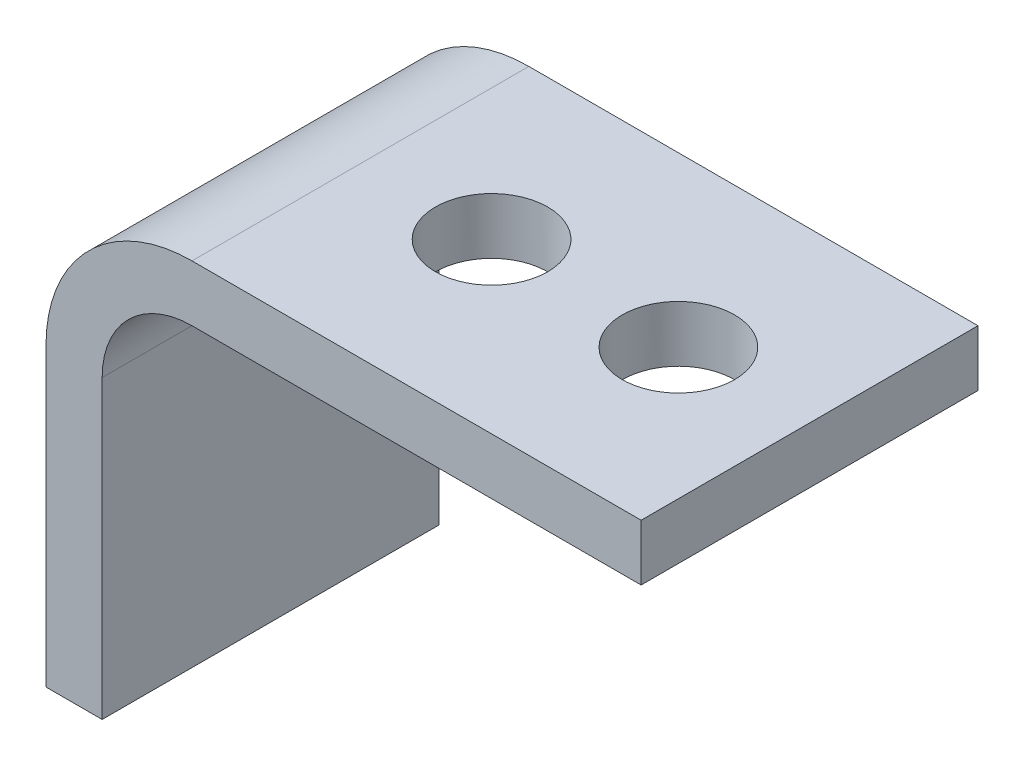
ISO-10303-21;
HEADER;
FILE_DESCRIPTION(('STEP AP214'),'2;1');
FILE_NAME('part.step','',(''),(''),'','','');
FILE_SCHEMA(('AUTOMOTIVE_DESIGN { 1 0 10303 214 1 1 1 1 }'));
ENDSEC;
DATA;
#1=APPLICATION_CONTEXT('core data for automotive mechanical design processes');
#2=APPLICATION_PROTOCOL_DEFINITION('international standard','automotive_design',2000,#1);
#3=PRODUCT_CONTEXT('',#1,'mechanical');
#4=PRODUCT('Part','Part','',(#3));
#5=PRODUCT_RELATED_PRODUCT_CATEGORY('part','',(#4));
#6=PRODUCT_DEFINITION_FORMATION('','',#4);
#7=PRODUCT_DEFINITION_CONTEXT('part definition',#1,'design');
#8=PRODUCT_DEFINITION('design','',#6,#7);
#9=PRODUCT_DEFINITION_SHAPE('','',#8);
#10=(LENGTH_UNIT() NAMED_UNIT(*) SI_UNIT(.MILLI.,.METRE.));
#11=(NAMED_UNIT(*) PLANE_ANGLE_UNIT() SI_UNIT($,.RADIAN.));
#12=(NAMED_UNIT(*) SI_UNIT($,.STERADIAN.) SOLID_ANGLE_UNIT());
#13=UNCERTAINTY_MEASURE_WITH_UNIT(LENGTH_MEASURE(1.E-05),#10,'distance_accuracy_value','');
#14=(GEOMETRIC_REPRESENTATION_CONTEXT(3) GLOBAL_UNCERTAINTY_ASSIGNED_CONTEXT((#13)) GLOBAL_UNIT_ASSIGNED_CONTEXT((#10,
#11,#12)) REPRESENTATION_CONTEXT('',''));
#15=CARTESIAN_POINT('',(0.,0.,0.));
#16=DIRECTION('',(0.,0.,1.));
#17=DIRECTION('',(1.,0.,0.));
#18=AXIS2_PLACEMENT_3D('',#15,#16,#17);
#19=CARTESIAN_POINT('',(-1.5875,0.,9.525));
#20=DIRECTION('',(0.,1.,0.));
#21=DIRECTION('',(0.,0.,1.));
#22=AXIS2_PLACEMENT_3D('',#19,#20,#21);
#23=PLANE('',#22);
#24=DIRECTION('',(1.,0.,0.));
#25=VECTOR('',#24,1.);
#26=CARTESIAN_POINT('',(-1.5875,0.,0.));
#27=LINE('',#26,#25);
#28=CARTESIAN_POINT('',(-1.5875,0.,0.));
#29=VERTEX_POINT('',#28);
#30=CARTESIAN_POINT('',(0.,0.,0.));
#31=VERTEX_POINT('',#30);
#32=EDGE_CURVE('E142',#29,#31,#27,.T.);
#33=ORIENTED_EDGE('',*,*,#32,.T.);
#34=DIRECTION('',(0.,0.,-1.));
#35=VECTOR('',#34,1.);
#36=CARTESIAN_POINT('',(0.,0.,9.525));
#37=LINE('',#36,#35);
#38=CARTESIAN_POINT('',(0.,0.,9.525));
#39=VERTEX_POINT('',#38);
#40=EDGE_CURVE('E11',#39,#31,#37,.T.);
#41=ORIENTED_EDGE('',*,*,#40,.F.);
#42=DIRECTION('',(1.,0.,0.));
#43=VECTOR('',#42,1.);
#44=CARTESIAN_POINT('',(-1.5875,0.,9.525));
#45=LINE('',#44,#43);
#46=CARTESIAN_POINT('',(-1.5875,0.,9.525));
#47=VERTEX_POINT('',#46);
#48=EDGE_CURVE('E165',#47,#39,#45,.T.);
#49=ORIENTED_EDGE('',*,*,#48,.F.);
#50=DIRECTION('',(0.,0.,-1.));
#51=VECTOR('',#50,1.);
#52=CARTESIAN_POINT('',(-1.5875,0.,9.525));
#53=LINE('',#52,#51);
#54=EDGE_CURVE('E138',#47,#29,#53,.T.);
#55=ORIENTED_EDGE('',*,*,#54,.T.);
#56=EDGE_LOOP('',(#33,#41,#49,#55));
#57=FACE_BOUND('',#56,.T.);
#58=ADVANCED_FACE('F39',(#57),#23,.F.);
#59=CARTESIAN_POINT('',(0.,0.,9.525));
#60=DIRECTION('',(-1.,0.,0.));
#61=DIRECTION('',(0.,0.,1.));
#62=AXIS2_PLACEMENT_3D('',#59,#60,#61);
#63=PLANE('',#62);
#64=CARTESIAN_POINT('',(0.,6.27699999999983,2.25));
#65=DIRECTION('',(-1.,0.,0.));
#66=DIRECTION('',(0.,0.,1.));
#67=AXIS2_PLACEMENT_3D('',#64,#65,#66);
#68=CIRCLE('',#67,0.749999999999999);
#69=CARTESIAN_POINT('',(0.,6.27699999999983,3.));
#70=VERTEX_POINT('',#69);
#71=EDGE_CURVE('E147',#70,#70,#68,.T.);
#72=ORIENTED_EDGE('',*,*,#71,.T.);
#73=EDGE_LOOP('',(#72));
#74=FACE_BOUND('',#73,.T.);
#75=DIRECTION('',(0.,1.,0.));
#76=VECTOR('',#75,1.);
#77=CARTESIAN_POINT('',(0.,0.,0.));
#78=LINE('',#77,#76);
#79=CARTESIAN_POINT('',(0.,8.3725,0.));
#80=VERTEX_POINT('',#79);
#81=EDGE_CURVE('E146',#31,#80,#78,.T.);
#82=ORIENTED_EDGE('',*,*,#81,.T.);
#83=DIRECTION('',(0.,0.,-1.));
#84=VECTOR('',#83,1.);
#85=CARTESIAN_POINT('',(0.,8.3725,9.525));
#86=LINE('',#85,#84);
#87=CARTESIAN_POINT('',(0.,8.3725,9.525));
#88=VERTEX_POINT('',#87);
#89=EDGE_CURVE('E49',#88,#80,#86,.T.);
#90=ORIENTED_EDGE('',*,*,#89,.F.);
#91=DIRECTION('',(0.,1.,0.));
#92=VECTOR('',#91,1.);
#93=CARTESIAN_POINT('',(0.,0.,9.525));
#94=LINE('',#93,#92);
#95=EDGE_CURVE('E101',#39,#88,#94,.T.);
#96=ORIENTED_EDGE('',*,*,#95,.F.);
#97=ORIENTED_EDGE('',*,*,#40,.T.);
#98=EDGE_LOOP('',(#82,#90,#96,#97));
#99=FACE_BOUND('',#98,.T.);
#100=ADVANCED_FACE('F246',(#74,#99),#63,.F.);
#101=CARTESIAN_POINT('',(2.54,8.3725,9.525));
#102=DIRECTION('',(0.,0.,-1.));
#103=DIRECTION('',(-1.,0.,0.));
#104=AXIS2_PLACEMENT_3D('',#101,#102,#103);
#105=CYLINDRICAL_SURFACE('',#104,2.54);
#106=CARTESIAN_POINT('',(2.54,8.3725,0.));
#107=DIRECTION('',(0.,0.,-1.));
#108=DIRECTION('',(-1.,0.,0.));
#109=AXIS2_PLACEMENT_3D('',#106,#107,#108);
#110=CIRCLE('',#109,2.54);
#111=CARTESIAN_POINT('',(2.54,10.9125,0.));
#112=VERTEX_POINT('',#111);
#113=EDGE_CURVE('E150',#80,#112,#110,.T.);
#114=ORIENTED_EDGE('',*,*,#113,.T.);
#115=DIRECTION('',(0.,0.,-1.));
#116=VECTOR('',#115,1.);
#117=CARTESIAN_POINT('',(2.54,10.9125,9.525));
#118=LINE('',#117,#116);
#119=CARTESIAN_POINT('',(2.54,10.9125,9.525));
#120=VERTEX_POINT('',#119);
#121=EDGE_CURVE('E176',#120,#112,#118,.T.);
#122=ORIENTED_EDGE('',*,*,#121,.F.);
#123=CARTESIAN_POINT('',(2.54,8.3725,9.525));
#124=DIRECTION('',(0.,0.,-1.));
#125=DIRECTION('',(-1.,0.,0.));
#126=AXIS2_PLACEMENT_3D('',#123,#124,#125);
#127=CIRCLE('',#126,2.54);
#128=EDGE_CURVE('E211',#88,#120,#127,.T.);
#129=ORIENTED_EDGE('',*,*,#128,.F.);
#130=ORIENTED_EDGE('',*,*,#89,.T.);
#131=EDGE_LOOP('',(#114,#122,#129,#130));
#132=FACE_BOUND('',#131,.T.);
#133=ADVANCED_FACE('F250',(#132),#105,.F.);
#134=CARTESIAN_POINT('',(2.54,10.9125,9.525));
#135=DIRECTION('',(0.,1.,0.));
#136=DIRECTION('',(-1.,0.,0.));
#137=AXIS2_PLACEMENT_3D('',#134,#135,#136);
#138=PLANE('',#137);
#139=CARTESIAN_POINT('',(6.2484,10.9125,4.7625));
#140=DIRECTION('',(0.,-1.,0.));
#141=DIRECTION('',(1.,0.,0.));
#142=AXIS2_PLACEMENT_3D('',#139,#140,#141);
#143=CIRCLE('',#142,1.5875);
#144=CARTESIAN_POINT('',(7.8359,10.9125,4.7625));
#145=VERTEX_POINT('',#144);
#146=EDGE_CURVE('E185',#145,#145,#143,.T.);
#147=ORIENTED_EDGE('',*,*,#146,.F.);
#148=EDGE_LOOP('',(#147));
#149=FACE_BOUND('',#148,.T.);
#150=CARTESIAN_POINT('',(11.5316,10.9125,4.7625));
#151=DIRECTION('',(0.,-1.,0.));
#152=DIRECTION('',(1.,0.,0.));
#153=AXIS2_PLACEMENT_3D('',#150,#151,#152);
#154=CIRCLE('',#153,1.5875);
#155=CARTESIAN_POINT('',(13.1191,10.9125,4.7625));
#156=VERTEX_POINT('',#155);
#157=EDGE_CURVE('E193',#156,#156,#154,.T.);
#158=ORIENTED_EDGE('',*,*,#157,.F.);
#159=EDGE_LOOP('',(#158));
#160=FACE_BOUND('',#159,.T.);
#161=DIRECTION('',(1.,0.,0.));
#162=VECTOR('',#161,1.);
#163=CARTESIAN_POINT('',(2.54,10.9125,0.));
#164=LINE('',#163,#162);
#165=CARTESIAN_POINT('',(15.24,10.9125,0.));
#166=VERTEX_POINT('',#165);
#167=EDGE_CURVE('E153',#112,#166,#164,.T.);
#168=ORIENTED_EDGE('',*,*,#167,.T.);
#169=DIRECTION('',(0.,0.,-1.));
#170=VECTOR('',#169,1.);
#171=CARTESIAN_POINT('',(15.24,10.9125,9.525));
#172=LINE('',#171,#170);
#173=CARTESIAN_POINT('',(15.24,10.9125,9.525));
#174=VERTEX_POINT('',#173);
#175=EDGE_CURVE('E172',#174,#166,#172,.T.);
#176=ORIENTED_EDGE('',*,*,#175,.F.);
#177=DIRECTION('',(1.,0.,0.));
#178=VECTOR('',#177,1.);
#179=CARTESIAN_POINT('',(2.54,10.9125,9.525));
#180=LINE('',#179,#178);
#181=EDGE_CURVE('E214',#120,#174,#180,.T.);
#182=ORIENTED_EDGE('',*,*,#181,.F.);
#183=ORIENTED_EDGE('',*,*,#121,.T.);
#184=EDGE_LOOP('',(#168,#176,#182,#183));
#185=FACE_BOUND('',#184,.T.);
#186=ADVANCED_FACE('F222',(#149,#160,#185),#138,.F.);
#187=CARTESIAN_POINT('',(15.24,10.9125,9.525));
#188=DIRECTION('',(-1.,0.,0.));
#189=DIRECTION('',(0.,0.,1.));
#190=AXIS2_PLACEMENT_3D('',#187,#188,#189);
#191=PLANE('',#190);
#192=DIRECTION('',(0.,1.,0.));
#193=VECTOR('',#192,1.);
#194=CARTESIAN_POINT('',(15.24,10.9125,0.));
#195=LINE('',#194,#193);
#196=CARTESIAN_POINT('',(15.24,12.5,0.));
#197=VERTEX_POINT('',#196);
#198=EDGE_CURVE('E156',#166,#197,#195,.T.);
#199=ORIENTED_EDGE('',*,*,#198,.T.);
#200=DIRECTION('',(0.,0.,-1.));
#201=VECTOR('',#200,1.);
#202=CARTESIAN_POINT('',(15.24,12.5,9.525));
#203=LINE('',#202,#201);
#204=CARTESIAN_POINT('',(15.24,12.5,9.525));
#205=VERTEX_POINT('',#204);
#206=EDGE_CURVE('E131',#205,#197,#203,.T.);
#207=ORIENTED_EDGE('',*,*,#206,.F.);
#208=DIRECTION('',(0.,1.,0.));
#209=VECTOR('',#208,1.);
#210=CARTESIAN_POINT('',(15.24,10.9125,9.525));
#211=LINE('',#210,#209);
#212=EDGE_CURVE('E120',#174,#205,#211,.T.);
#213=ORIENTED_EDGE('',*,*,#212,.F.);
#214=ORIENTED_EDGE('',*,*,#175,.T.);
#215=EDGE_LOOP('',(#199,#207,#213,#214));
#216=FACE_BOUND('',#215,.T.);
#217=ADVANCED_FACE('F226',(#216),#191,.F.);
#218=CARTESIAN_POINT('',(2.54,12.5,9.525));
#219=DIRECTION('',(0.,-1.,0.));
#220=DIRECTION('',(0.,0.,-1.));
#221=AXIS2_PLACEMENT_3D('',#218,#219,#220);
#222=PLANE('',#221);
#223=CARTESIAN_POINT('',(6.2484,12.5,4.7625));
#224=DIRECTION('',(0.,-1.,0.));
#225=DIRECTION('',(0.,0.,-1.));
#226=AXIS2_PLACEMENT_3D('',#223,#224,#225);
#227=CIRCLE('',#226,1.5875);
#228=CARTESIAN_POINT('',(6.2484,12.5,3.175));
#229=VERTEX_POINT('',#228);
#230=EDGE_CURVE('E42',#229,#229,#227,.T.);
#231=ORIENTED_EDGE('',*,*,#230,.T.);
#232=EDGE_LOOP('',(#231));
#233=FACE_BOUND('',#232,.T.);
#234=CARTESIAN_POINT('',(11.5316,12.5,4.7625));
#235=DIRECTION('',(0.,-1.,0.));
#236=DIRECTION('',(0.,0.,-1.));
#237=AXIS2_PLACEMENT_3D('',#234,#235,#236);
#238=CIRCLE('',#237,1.5875);
#239=CARTESIAN_POINT('',(11.5316,12.5,3.175));
#240=VERTEX_POINT('',#239);
#241=EDGE_CURVE('E182',#240,#240,#238,.T.);
#242=ORIENTED_EDGE('',*,*,#241,.T.);
#243=EDGE_LOOP('',(#242));
#244=FACE_BOUND('',#243,.T.);
#245=DIRECTION('',(-1.,0.,0.));
#246=VECTOR('',#245,1.);
#247=CARTESIAN_POINT('',(2.54,12.5,0.));
#248=LINE('',#247,#246);
#249=CARTESIAN_POINT('',(2.54,12.5,0.));
#250=VERTEX_POINT('',#249);
#251=EDGE_CURVE('E129',#197,#250,#248,.T.);
#252=ORIENTED_EDGE('',*,*,#251,.T.);
#253=DIRECTION('',(0.,0.,-1.));
#254=VECTOR('',#253,1.);
#255=CARTESIAN_POINT('',(2.54,12.5,9.525));
#256=LINE('',#255,#254);
#257=CARTESIAN_POINT('',(2.54,12.5,9.525));
#258=VERTEX_POINT('',#257);
#259=EDGE_CURVE('E126',#258,#250,#256,.T.);
#260=ORIENTED_EDGE('',*,*,#259,.F.);
#261=DIRECTION('',(-1.,0.,0.));
#262=VECTOR('',#261,1.);
#263=CARTESIAN_POINT('',(2.54,12.5,9.525));
#264=LINE('',#263,#262);
#265=EDGE_CURVE('E114',#205,#258,#264,.T.);
#266=ORIENTED_EDGE('',*,*,#265,.F.);
#267=ORIENTED_EDGE('',*,*,#206,.T.);
#268=EDGE_LOOP('',(#252,#260,#266,#267));
#269=FACE_BOUND('',#268,.T.);
#270=ADVANCED_FACE('F127',(#233,#244,#269),#222,.F.);
#271=CARTESIAN_POINT('',(2.54,8.3725,9.525));
#272=DIRECTION('',(0.,0.,-1.));
#273=DIRECTION('',(-1.,0.,0.));
#274=AXIS2_PLACEMENT_3D('',#271,#272,#273);
#275=CYLINDRICAL_SURFACE('',#274,4.1275);
#276=CARTESIAN_POINT('',(2.54,8.3725,0.));
#277=DIRECTION('',(0.,0.,1.));
#278=DIRECTION('',(-1.,0.,0.));
#279=AXIS2_PLACEMENT_3D('',#276,#277,#278);
#280=CIRCLE('',#279,4.1275);
#281=CARTESIAN_POINT('',(-1.5875,8.3725,0.));
#282=VERTEX_POINT('',#281);
#283=EDGE_CURVE('E87',#250,#282,#280,.T.);
#284=ORIENTED_EDGE('',*,*,#283,.T.);
#285=DIRECTION('',(0.,0.,-1.));
#286=VECTOR('',#285,1.);
#287=CARTESIAN_POINT('',(-1.5875,8.3725,9.525));
#288=LINE('',#287,#286);
#289=CARTESIAN_POINT('',(-1.5875,8.3725,9.525));
#290=VERTEX_POINT('',#289);
#291=EDGE_CURVE('E132',#290,#282,#288,.T.);
#292=ORIENTED_EDGE('',*,*,#291,.F.);
#293=CARTESIAN_POINT('',(2.54,8.3725,9.525));
#294=DIRECTION('',(0.,0.,1.));
#295=DIRECTION('',(-1.,0.,0.));
#296=AXIS2_PLACEMENT_3D('',#293,#294,#295);
#297=CIRCLE('',#296,4.1275);
#298=EDGE_CURVE('E118',#258,#290,#297,.T.);
#299=ORIENTED_EDGE('',*,*,#298,.F.);
#300=ORIENTED_EDGE('',*,*,#259,.T.);
#301=EDGE_LOOP('',(#284,#292,#299,#300));
#302=FACE_BOUND('',#301,.T.);
#303=ADVANCED_FACE('F134',(#302),#275,.T.);
#304=CARTESIAN_POINT('',(-1.5875,0.,9.525));
#305=DIRECTION('',(1.,0.,0.));
#306=DIRECTION('',(0.,0.,-1.));
#307=AXIS2_PLACEMENT_3D('',#304,#305,#306);
#308=PLANE('',#307);
#309=CARTESIAN_POINT('',(-1.5875,6.27699999999983,2.25));
#310=DIRECTION('',(1.,0.,0.));
#311=DIRECTION('',(0.,0.,-1.));
#312=AXIS2_PLACEMENT_3D('',#309,#310,#311);
#313=CIRCLE('',#312,0.749999999999999);
#314=CARTESIAN_POINT('',(-1.5875,6.27699999999983,1.5));
#315=VERTEX_POINT('',#314);
#316=EDGE_CURVE('E191',#315,#315,#313,.T.);
#317=ORIENTED_EDGE('',*,*,#316,.T.);
#318=EDGE_LOOP('',(#317));
#319=FACE_BOUND('',#318,.T.);
#320=DIRECTION('',(0.,-1.,0.));
#321=VECTOR('',#320,1.);
#322=CARTESIAN_POINT('',(-1.5875,0.,0.));
#323=LINE('',#322,#321);
#324=EDGE_CURVE('E93',#282,#29,#323,.T.);
#325=ORIENTED_EDGE('',*,*,#324,.T.);
#326=ORIENTED_EDGE('',*,*,#54,.F.);
#327=DIRECTION('',(0.,-1.,0.));
#328=VECTOR('',#327,1.);
#329=CARTESIAN_POINT('',(-1.5875,0.,9.525));
#330=LINE('',#329,#328);
#331=EDGE_CURVE('E58',#290,#47,#330,.T.);
#332=ORIENTED_EDGE('',*,*,#331,.F.);
#333=ORIENTED_EDGE('',*,*,#291,.T.);
#334=EDGE_LOOP('',(#325,#326,#332,#333));
#335=FACE_BOUND('',#334,.T.);
#336=ADVANCED_FACE('F234',(#319,#335),#308,.F.);
#337=CARTESIAN_POINT('',(2.54,8.3725,9.525));
#338=DIRECTION('',(0.,0.,-1.));
#339=DIRECTION('',(-1.,0.,0.));
#340=AXIS2_PLACEMENT_3D('',#337,#338,#339);
#341=PLANE('',#340);
#342=ORIENTED_EDGE('',*,*,#48,.T.);
#343=ORIENTED_EDGE('',*,*,#95,.T.);
#344=ORIENTED_EDGE('',*,*,#128,.T.);
#345=ORIENTED_EDGE('',*,*,#181,.T.);
#346=ORIENTED_EDGE('',*,*,#212,.T.);
#347=ORIENTED_EDGE('',*,*,#265,.T.);
#348=ORIENTED_EDGE('',*,*,#298,.T.);
#349=ORIENTED_EDGE('',*,*,#331,.T.);
#350=EDGE_LOOP('',(#342,#343,#344,#345,#346,#347,#348,#349));
#351=FACE_BOUND('',#350,.T.);
#352=ADVANCED_FACE('F116',(#351),#341,.F.);
#353=CARTESIAN_POINT('',(2.54,8.3725,0.));
#354=DIRECTION('',(0.,0.,-1.));
#355=DIRECTION('',(-1.,0.,0.));
#356=AXIS2_PLACEMENT_3D('',#353,#354,#355);
#357=PLANE('',#356);
#358=ORIENTED_EDGE('',*,*,#32,.F.);
#359=ORIENTED_EDGE('',*,*,#324,.F.);
#360=ORIENTED_EDGE('',*,*,#283,.F.);
#361=ORIENTED_EDGE('',*,*,#251,.F.);
#362=ORIENTED_EDGE('',*,*,#198,.F.);
#363=ORIENTED_EDGE('',*,*,#167,.F.);
#364=ORIENTED_EDGE('',*,*,#113,.F.);
#365=ORIENTED_EDGE('',*,*,#81,.F.);
#366=EDGE_LOOP('',(#358,#359,#360,#361,#362,#363,#364,#365));
#367=FACE_BOUND('',#366,.T.);
#368=ADVANCED_FACE('F229',(#367),#357,.T.);
#369=CARTESIAN_POINT('',(-1.5885,6.27699999999983,2.25));
#370=DIRECTION('',(1.,0.,0.));
#371=DIRECTION('',(0.,0.,-1.));
#372=AXIS2_PLACEMENT_3D('',#369,#370,#371);
#373=CYLINDRICAL_SURFACE('',#372,0.749999999999999);
#374=ORIENTED_EDGE('',*,*,#71,.F.);
#375=EDGE_LOOP('',(#374));
#376=FACE_BOUND('',#375,.T.);
#377=ORIENTED_EDGE('',*,*,#316,.F.);
#378=EDGE_LOOP('',(#377));
#379=FACE_BOUND('',#378,.T.);
#380=ADVANCED_FACE('F276',(#376,#379),#373,.F.);
#381=CARTESIAN_POINT('',(11.5316,13.4525,4.7625));
#382=DIRECTION('',(0.,-1.,0.));
#383=DIRECTION('',(1.,0.,0.));
#384=AXIS2_PLACEMENT_3D('',#381,#382,#383);
#385=CYLINDRICAL_SURFACE('',#384,1.5875);
#386=ORIENTED_EDGE('',*,*,#157,.T.);
#387=EDGE_LOOP('',(#386));
#388=FACE_BOUND('',#387,.T.);
#389=ORIENTED_EDGE('',*,*,#241,.F.);
#390=EDGE_LOOP('',(#389));
#391=FACE_BOUND('',#390,.T.);
#392=ADVANCED_FACE('F271',(#388,#391),#385,.F.);
#393=CARTESIAN_POINT('',(6.2484,13.4525,4.7625));
#394=DIRECTION('',(0.,-1.,0.));
#395=DIRECTION('',(1.,0.,0.));
#396=AXIS2_PLACEMENT_3D('',#393,#394,#395);
#397=CYLINDRICAL_SURFACE('',#396,1.5875);
#398=ORIENTED_EDGE('',*,*,#146,.T.);
#399=EDGE_LOOP('',(#398));
#400=FACE_BOUND('',#399,.T.);
#401=ORIENTED_EDGE('',*,*,#230,.F.);
#402=EDGE_LOOP('',(#401));
#403=FACE_BOUND('',#402,.T.);
#404=ADVANCED_FACE('F269',(#400,#403),#397,.F.);
#405=CLOSED_SHELL('',(#58,#100,#133,#186,#217,#270,#303,#336,#352,#368,#380,#392,#404));
#406=MANIFOLD_SOLID_BREP('B2',#405);
#407=ADVANCED_BREP_SHAPE_REPRESENTATION('',(#18,#406),#14);
#408=SHAPE_DEFINITION_REPRESENTATION(#9,#407);
ENDSEC;
END-ISO-10303-21;
